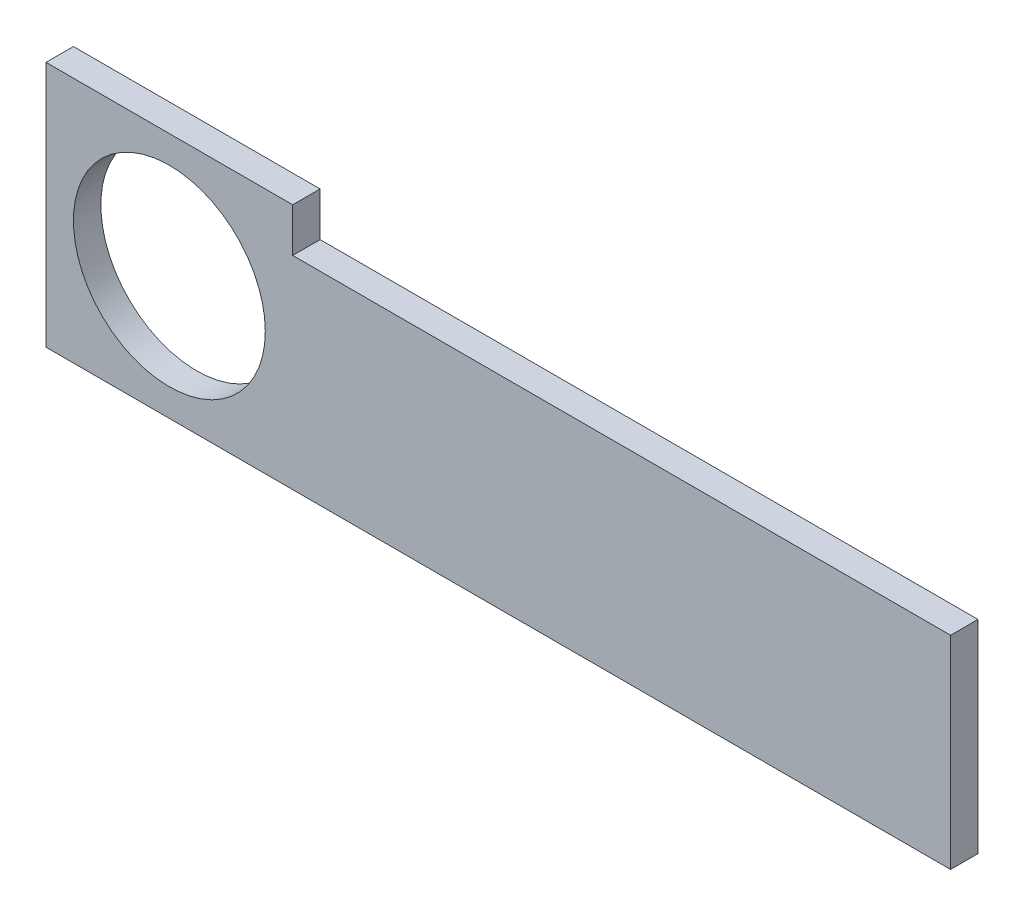
ISO-10303-21;
HEADER;
FILE_DESCRIPTION(('STEP AP214'),'2;1');
FILE_NAME('part.step','',(''),(''),'','','');
FILE_SCHEMA(('AUTOMOTIVE_DESIGN { 1 0 10303 214 1 1 1 1 }'));
ENDSEC;
DATA;
#1=APPLICATION_CONTEXT('core data for automotive mechanical design processes');
#2=APPLICATION_PROTOCOL_DEFINITION('international standard','automotive_design',2000,#1);
#3=PRODUCT_CONTEXT('',#1,'mechanical');
#4=PRODUCT('Part','Part','',(#3));
#5=PRODUCT_RELATED_PRODUCT_CATEGORY('part','',(#4));
#6=PRODUCT_DEFINITION_FORMATION('','',#4);
#7=PRODUCT_DEFINITION_CONTEXT('part definition',#1,'design');
#8=PRODUCT_DEFINITION('design','',#6,#7);
#9=PRODUCT_DEFINITION_SHAPE('','',#8);
#10=(LENGTH_UNIT() NAMED_UNIT(*) SI_UNIT(.MILLI.,.METRE.));
#11=(NAMED_UNIT(*) PLANE_ANGLE_UNIT() SI_UNIT($,.RADIAN.));
#12=(NAMED_UNIT(*) SI_UNIT($,.STERADIAN.) SOLID_ANGLE_UNIT());
#13=UNCERTAINTY_MEASURE_WITH_UNIT(LENGTH_MEASURE(1.E-05),#10,'distance_accuracy_value','');
#14=(GEOMETRIC_REPRESENTATION_CONTEXT(3) GLOBAL_UNCERTAINTY_ASSIGNED_CONTEXT((#13)) GLOBAL_UNIT_ASSIGNED_CONTEXT((#10,
#11,#12)) REPRESENTATION_CONTEXT('',''));
#15=CARTESIAN_POINT('',(0.,0.,0.));
#16=DIRECTION('',(0.,0.,1.));
#17=DIRECTION('',(1.,0.,0.));
#18=AXIS2_PLACEMENT_3D('',#15,#16,#17);
#19=CARTESIAN_POINT('',(-100.300605601986,96.1433263689146,10.));
#20=DIRECTION('',(-1.,0.,0.));
#21=DIRECTION('',(0.,-1.,0.));
#22=AXIS2_PLACEMENT_3D('',#19,#20,#21);
#23=PLANE('',#22);
#24=DIRECTION('',(0.,1.,0.));
#25=VECTOR('',#24,1.);
#26=CARTESIAN_POINT('',(-100.300605601986,96.1433263689146,0.));
#27=LINE('',#26,#25);
#28=CARTESIAN_POINT('',(-100.300605601986,22.1433263689146,0.));
#29=VERTEX_POINT('',#28);
#30=CARTESIAN_POINT('',(-100.300605601986,96.1433263689146,0.));
#31=VERTEX_POINT('',#30);
#32=EDGE_CURVE('E117',#29,#31,#27,.T.);
#33=ORIENTED_EDGE('',*,*,#32,.T.);
#34=DIRECTION('',(0.,0.,-1.));
#35=VECTOR('',#34,1.);
#36=CARTESIAN_POINT('',(-100.300605601986,96.1433263689146,10.));
#37=LINE('',#36,#35);
#38=CARTESIAN_POINT('',(-100.300605601986,96.1433263689146,10.));
#39=VERTEX_POINT('',#38);
#40=EDGE_CURVE('E11',#39,#31,#37,.T.);
#41=ORIENTED_EDGE('',*,*,#40,.F.);
#42=DIRECTION('',(0.,1.,0.));
#43=VECTOR('',#42,1.);
#44=CARTESIAN_POINT('',(-100.300605601986,96.1433263689146,10.));
#45=LINE('',#44,#43);
#46=CARTESIAN_POINT('',(-100.300605601986,22.1433263689146,10.));
#47=VERTEX_POINT('',#46);
#48=EDGE_CURVE('E128',#47,#39,#45,.T.);
#49=ORIENTED_EDGE('',*,*,#48,.F.);
#50=DIRECTION('',(0.,0.,-1.));
#51=VECTOR('',#50,1.);
#52=CARTESIAN_POINT('',(-100.300605601986,22.1433263689146,10.));
#53=LINE('',#52,#51);
#54=EDGE_CURVE('E113',#47,#29,#53,.T.);
#55=ORIENTED_EDGE('',*,*,#54,.T.);
#56=EDGE_LOOP('',(#33,#41,#49,#55));
#57=FACE_BOUND('',#56,.T.);
#58=ADVANCED_FACE('F33',(#57),#23,.F.);
#59=CARTESIAN_POINT('',(-100.300605601986,96.1433263689146,10.));
#60=DIRECTION('',(0.,-1.,0.));
#61=DIRECTION('',(1.,0.,0.));
#62=AXIS2_PLACEMENT_3D('',#59,#60,#61);
#63=PLANE('',#62);
#64=DIRECTION('',(-1.,0.,0.));
#65=VECTOR('',#64,1.);
#66=CARTESIAN_POINT('',(-100.300605601986,96.1433263689146,0.));
#67=LINE('',#66,#65);
#68=CARTESIAN_POINT('',(-340.300605601986,96.1433263689146,0.));
#69=VERTEX_POINT('',#68);
#70=EDGE_CURVE('E120',#31,#69,#67,.T.);
#71=ORIENTED_EDGE('',*,*,#70,.T.);
#72=DIRECTION('',(0.,0.,-1.));
#73=VECTOR('',#72,1.);
#74=CARTESIAN_POINT('',(-340.300605601986,96.1433263689146,10.));
#75=LINE('',#74,#73);
#76=CARTESIAN_POINT('',(-340.300605601986,96.1433263689146,10.));
#77=VERTEX_POINT('',#76);
#78=EDGE_CURVE('E41',#77,#69,#75,.T.);
#79=ORIENTED_EDGE('',*,*,#78,.F.);
#80=DIRECTION('',(-1.,0.,0.));
#81=VECTOR('',#80,1.);
#82=CARTESIAN_POINT('',(-100.300605601986,96.1433263689146,10.));
#83=LINE('',#82,#81);
#84=EDGE_CURVE('E85',#39,#77,#83,.T.);
#85=ORIENTED_EDGE('',*,*,#84,.F.);
#86=ORIENTED_EDGE('',*,*,#40,.T.);
#87=EDGE_LOOP('',(#71,#79,#85,#86));
#88=FACE_BOUND('',#87,.T.);
#89=ADVANCED_FACE('F153',(#88),#63,.F.);
#90=CARTESIAN_POINT('',(-340.300605601986,96.1433263689146,10.));
#91=DIRECTION('',(-1.,0.,0.));
#92=DIRECTION('',(0.,0.,1.));
#93=AXIS2_PLACEMENT_3D('',#90,#91,#92);
#94=PLANE('',#93);
#95=DIRECTION('',(0.,1.,0.));
#96=VECTOR('',#95,1.);
#97=CARTESIAN_POINT('',(-340.300605601986,96.1433263689146,0.));
#98=LINE('',#97,#96);
#99=CARTESIAN_POINT('',(-340.300605601986,112.143326368915,0.));
#100=VERTEX_POINT('',#99);
#101=EDGE_CURVE('E123',#69,#100,#98,.T.);
#102=ORIENTED_EDGE('',*,*,#101,.T.);
#103=DIRECTION('',(0.,0.,-1.));
#104=VECTOR('',#103,1.);
#105=CARTESIAN_POINT('',(-340.300605601986,112.143326368915,10.));
#106=LINE('',#105,#104);
#107=CARTESIAN_POINT('',(-340.300605601986,112.143326368915,10.));
#108=VERTEX_POINT('',#107);
#109=EDGE_CURVE('E108',#108,#100,#106,.T.);
#110=ORIENTED_EDGE('',*,*,#109,.F.);
#111=DIRECTION('',(0.,1.,0.));
#112=VECTOR('',#111,1.);
#113=CARTESIAN_POINT('',(-340.300605601986,96.1433263689146,10.));
#114=LINE('',#113,#112);
#115=EDGE_CURVE('E98',#77,#108,#114,.T.);
#116=ORIENTED_EDGE('',*,*,#115,.F.);
#117=ORIENTED_EDGE('',*,*,#78,.T.);
#118=EDGE_LOOP('',(#102,#110,#116,#117));
#119=FACE_BOUND('',#118,.T.);
#120=ADVANCED_FACE('F134',(#119),#94,.F.);
#121=CARTESIAN_POINT('',(-340.300605601986,112.143326368915,10.));
#122=DIRECTION('',(0.,-1.,0.));
#123=DIRECTION('',(0.,0.,-1.));
#124=AXIS2_PLACEMENT_3D('',#121,#122,#123);
#125=PLANE('',#124);
#126=DIRECTION('',(-1.,0.,0.));
#127=VECTOR('',#126,1.);
#128=CARTESIAN_POINT('',(-340.300605601986,112.143326368915,0.));
#129=LINE('',#128,#127);
#130=CARTESIAN_POINT('',(-430.300605601986,112.143326368915,0.));
#131=VERTEX_POINT('',#130);
#132=EDGE_CURVE('E107',#100,#131,#129,.T.);
#133=ORIENTED_EDGE('',*,*,#132,.T.);
#134=DIRECTION('',(0.,0.,-1.));
#135=VECTOR('',#134,1.);
#136=CARTESIAN_POINT('',(-430.300605601986,112.143326368915,10.));
#137=LINE('',#136,#135);
#138=CARTESIAN_POINT('',(-430.300605601986,112.143326368915,10.));
#139=VERTEX_POINT('',#138);
#140=EDGE_CURVE('E104',#139,#131,#137,.T.);
#141=ORIENTED_EDGE('',*,*,#140,.F.);
#142=DIRECTION('',(-1.,0.,0.));
#143=VECTOR('',#142,1.);
#144=CARTESIAN_POINT('',(-340.300605601986,112.143326368915,10.));
#145=LINE('',#144,#143);
#146=EDGE_CURVE('E92',#108,#139,#145,.T.);
#147=ORIENTED_EDGE('',*,*,#146,.F.);
#148=ORIENTED_EDGE('',*,*,#109,.T.);
#149=EDGE_LOOP('',(#133,#141,#147,#148));
#150=FACE_BOUND('',#149,.T.);
#151=ADVANCED_FACE('F105',(#150),#125,.F.);
#152=CARTESIAN_POINT('',(-430.300605601986,96.1433263689145,10.));
#153=DIRECTION('',(1.,0.,0.));
#154=DIRECTION('',(0.,0.,-1.));
#155=AXIS2_PLACEMENT_3D('',#152,#153,#154);
#156=PLANE('',#155);
#157=DIRECTION('',(0.,-1.,0.));
#158=VECTOR('',#157,1.);
#159=CARTESIAN_POINT('',(-430.300605601986,96.1433263689145,0.));
#160=LINE('',#159,#158);
#161=CARTESIAN_POINT('',(-430.300605601986,22.1433263689145,0.));
#162=VERTEX_POINT('',#161);
#163=EDGE_CURVE('E71',#131,#162,#160,.T.);
#164=ORIENTED_EDGE('',*,*,#163,.T.);
#165=DIRECTION('',(0.,0.,-1.));
#166=VECTOR('',#165,1.);
#167=CARTESIAN_POINT('',(-430.300605601986,22.1433263689145,10.));
#168=LINE('',#167,#166);
#169=CARTESIAN_POINT('',(-430.300605601986,22.1433263689145,10.));
#170=VERTEX_POINT('',#169);
#171=EDGE_CURVE('E109',#170,#162,#168,.T.);
#172=ORIENTED_EDGE('',*,*,#171,.F.);
#173=DIRECTION('',(0.,-1.,0.));
#174=VECTOR('',#173,1.);
#175=CARTESIAN_POINT('',(-430.300605601986,112.143326368915,10.));
#176=LINE('',#175,#174);
#177=EDGE_CURVE('E96',#139,#170,#176,.T.);
#178=ORIENTED_EDGE('',*,*,#177,.F.);
#179=ORIENTED_EDGE('',*,*,#140,.T.);
#180=EDGE_LOOP('',(#164,#172,#178,#179));
#181=FACE_BOUND('',#180,.T.);
#182=ADVANCED_FACE('F111',(#181),#156,.F.);
#183=CARTESIAN_POINT('',(-100.300605601986,22.1433263689146,10.));
#184=DIRECTION('',(0.,1.,0.));
#185=DIRECTION('',(-1.,0.,0.));
#186=AXIS2_PLACEMENT_3D('',#183,#184,#185);
#187=PLANE('',#186);
#188=DIRECTION('',(1.,0.,0.));
#189=VECTOR('',#188,1.);
#190=CARTESIAN_POINT('',(-100.300605601986,22.1433263689146,0.));
#191=LINE('',#190,#189);
#192=EDGE_CURVE('E77',#162,#29,#191,.T.);
#193=ORIENTED_EDGE('',*,*,#192,.T.);
#194=ORIENTED_EDGE('',*,*,#54,.F.);
#195=DIRECTION('',(1.,0.,0.));
#196=VECTOR('',#195,1.);
#197=CARTESIAN_POINT('',(-100.300605601986,22.1433263689146,10.));
#198=LINE('',#197,#196);
#199=EDGE_CURVE('E49',#170,#47,#198,.T.);
#200=ORIENTED_EDGE('',*,*,#199,.F.);
#201=ORIENTED_EDGE('',*,*,#171,.T.);
#202=EDGE_LOOP('',(#193,#194,#200,#201));
#203=FACE_BOUND('',#202,.T.);
#204=ADVANCED_FACE('F141',(#203),#187,.F.);
#205=CARTESIAN_POINT('',(0.,0.,10.));
#206=DIRECTION('',(0.,0.,-1.));
#207=DIRECTION('',(-1.,0.,0.));
#208=AXIS2_PLACEMENT_3D('',#205,#206,#207);
#209=PLANE('',#208);
#210=CARTESIAN_POINT('',(-385.300605601986,67.1433263689146,10.));
#211=DIRECTION('',(0.,0.,1.));
#212=DIRECTION('',(1.,0.,0.));
#213=AXIS2_PLACEMENT_3D('',#210,#211,#212);
#214=CIRCLE('',#213,35.);
#215=CARTESIAN_POINT('',(-350.300605601986,67.1433263689146,10.));
#216=VERTEX_POINT('',#215);
#217=EDGE_CURVE('E209',#216,#216,#214,.T.);
#218=ORIENTED_EDGE('',*,*,#217,.F.);
#219=EDGE_LOOP('',(#218));
#220=FACE_BOUND('',#219,.T.);
#221=ORIENTED_EDGE('',*,*,#48,.T.);
#222=ORIENTED_EDGE('',*,*,#84,.T.);
#223=ORIENTED_EDGE('',*,*,#115,.T.);
#224=ORIENTED_EDGE('',*,*,#146,.T.);
#225=ORIENTED_EDGE('',*,*,#177,.T.);
#226=ORIENTED_EDGE('',*,*,#199,.T.);
#227=EDGE_LOOP('',(#221,#222,#223,#224,#225,#226));
#228=FACE_BOUND('',#227,.T.);
#229=ADVANCED_FACE('F94',(#220,#228),#209,.F.);
#230=CARTESIAN_POINT('',(0.,0.,0.));
#231=DIRECTION('',(0.,0.,-1.));
#232=DIRECTION('',(-1.,0.,0.));
#233=AXIS2_PLACEMENT_3D('',#230,#231,#232);
#234=PLANE('',#233);
#235=CARTESIAN_POINT('',(-385.300605601986,67.1433263689146,0.));
#236=DIRECTION('',(0.,0.,1.));
#237=DIRECTION('',(1.,0.,0.));
#238=AXIS2_PLACEMENT_3D('',#235,#236,#237);
#239=CIRCLE('',#238,35.);
#240=CARTESIAN_POINT('',(-350.300605601986,67.1433263689146,0.));
#241=VERTEX_POINT('',#240);
#242=EDGE_CURVE('E121',#241,#241,#239,.T.);
#243=ORIENTED_EDGE('',*,*,#242,.T.);
#244=EDGE_LOOP('',(#243));
#245=FACE_BOUND('',#244,.T.);
#246=ORIENTED_EDGE('',*,*,#32,.F.);
#247=ORIENTED_EDGE('',*,*,#192,.F.);
#248=ORIENTED_EDGE('',*,*,#163,.F.);
#249=ORIENTED_EDGE('',*,*,#132,.F.);
#250=ORIENTED_EDGE('',*,*,#101,.F.);
#251=ORIENTED_EDGE('',*,*,#70,.F.);
#252=EDGE_LOOP('',(#246,#247,#248,#249,#250,#251));
#253=FACE_BOUND('',#252,.T.);
#254=ADVANCED_FACE('F137',(#245,#253),#234,.T.);
#255=CARTESIAN_POINT('',(-385.300605601986,67.1433263689146,0.));
#256=DIRECTION('',(0.,0.,1.));
#257=DIRECTION('',(1.,0.,0.));
#258=AXIS2_PLACEMENT_3D('',#255,#256,#257);
#259=CYLINDRICAL_SURFACE('',#258,35.);
#260=ORIENTED_EDGE('',*,*,#242,.F.);
#261=EDGE_LOOP('',(#260));
#262=FACE_BOUND('',#261,.T.);
#263=ORIENTED_EDGE('',*,*,#217,.T.);
#264=EDGE_LOOP('',(#263));
#265=FACE_BOUND('',#264,.T.);
#266=ADVANCED_FACE('F191',(#262,#265),#259,.F.);
#267=CLOSED_SHELL('',(#58,#89,#120,#151,#182,#204,#229,#254,#266));
#268=MANIFOLD_SOLID_BREP('B2',#267);
#269=ADVANCED_BREP_SHAPE_REPRESENTATION('',(#18,#268),#14);
#270=SHAPE_DEFINITION_REPRESENTATION(#9,#269);
ENDSEC;
END-ISO-10303-21;
